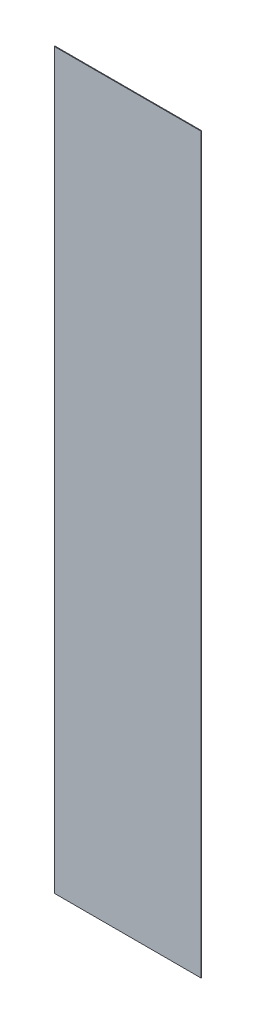
ISO-10303-21;
HEADER;
FILE_DESCRIPTION(('STEP AP214'),'2;1');
FILE_NAME('part.step','',(''),(''),'','','');
FILE_SCHEMA(('AUTOMOTIVE_DESIGN { 1 0 10303 214 1 1 1 1 }'));
ENDSEC;
DATA;
#1=APPLICATION_CONTEXT('core data for automotive mechanical design processes');
#2=APPLICATION_PROTOCOL_DEFINITION('international standard','automotive_design',2000,#1);
#3=PRODUCT_CONTEXT('',#1,'mechanical');
#4=PRODUCT('Part','Part','',(#3));
#5=PRODUCT_RELATED_PRODUCT_CATEGORY('part','',(#4));
#6=PRODUCT_DEFINITION_FORMATION('','',#4);
#7=PRODUCT_DEFINITION_CONTEXT('part definition',#1,'design');
#8=PRODUCT_DEFINITION('design','',#6,#7);
#9=PRODUCT_DEFINITION_SHAPE('','',#8);
#10=(LENGTH_UNIT() NAMED_UNIT(*) SI_UNIT(.MILLI.,.METRE.));
#11=(NAMED_UNIT(*) PLANE_ANGLE_UNIT() SI_UNIT($,.RADIAN.));
#12=(NAMED_UNIT(*) SI_UNIT($,.STERADIAN.) SOLID_ANGLE_UNIT());
#13=UNCERTAINTY_MEASURE_WITH_UNIT(LENGTH_MEASURE(1.E-05),#10,'distance_accuracy_value','');
#14=(GEOMETRIC_REPRESENTATION_CONTEXT(3) GLOBAL_UNCERTAINTY_ASSIGNED_CONTEXT((#13)) GLOBAL_UNIT_ASSIGNED_CONTEXT((#10,
#11,#12)) REPRESENTATION_CONTEXT('',''));
#15=CARTESIAN_POINT('',(0.,0.,0.));
#16=DIRECTION('',(0.,0.,1.));
#17=DIRECTION('',(1.,0.,0.));
#18=AXIS2_PLACEMENT_3D('',#15,#16,#17);
#19=CARTESIAN_POINT('',(200.,1000.,1.9));
#20=DIRECTION('',(-1.,0.,0.));
#21=DIRECTION('',(0.,-1.,0.));
#22=AXIS2_PLACEMENT_3D('',#19,#20,#21);
#23=PLANE('',#22);
#24=DIRECTION('',(0.,1.,0.));
#25=VECTOR('',#24,1.);
#26=CARTESIAN_POINT('',(200.,1000.,0.));
#27=LINE('',#26,#25);
#28=CARTESIAN_POINT('',(200.,-1000.,0.));
#29=VERTEX_POINT('',#28);
#30=CARTESIAN_POINT('',(200.,1000.,0.));
#31=VERTEX_POINT('',#30);
#32=EDGE_CURVE('E95',#29,#31,#27,.T.);
#33=ORIENTED_EDGE('',*,*,#32,.T.);
#34=DIRECTION('',(0.,0.,-1.));
#35=VECTOR('',#34,1.);
#36=CARTESIAN_POINT('',(200.,1000.,1.9));
#37=LINE('',#36,#35);
#38=CARTESIAN_POINT('',(200.,1000.,1.9));
#39=VERTEX_POINT('',#38);
#40=EDGE_CURVE('E11',#39,#31,#37,.T.);
#41=ORIENTED_EDGE('',*,*,#40,.F.);
#42=DIRECTION('',(0.,1.,0.));
#43=VECTOR('',#42,1.);
#44=CARTESIAN_POINT('',(200.,1000.,1.9));
#45=LINE('',#44,#43);
#46=CARTESIAN_POINT('',(200.,-1000.,1.9));
#47=VERTEX_POINT('',#46);
#48=EDGE_CURVE('E83',#47,#39,#45,.T.);
#49=ORIENTED_EDGE('',*,*,#48,.F.);
#50=DIRECTION('',(0.,0.,-1.));
#51=VECTOR('',#50,1.);
#52=CARTESIAN_POINT('',(200.,-1000.,1.9));
#53=LINE('',#52,#51);
#54=EDGE_CURVE('E91',#47,#29,#53,.T.);
#55=ORIENTED_EDGE('',*,*,#54,.T.);
#56=EDGE_LOOP('',(#33,#41,#49,#55));
#57=FACE_BOUND('',#56,.T.);
#58=ADVANCED_FACE('F32',(#57),#23,.F.);
#59=CARTESIAN_POINT('',(-200.,1000.,1.9));
#60=DIRECTION('',(0.,-1.,0.));
#61=DIRECTION('',(0.,0.,-1.));
#62=AXIS2_PLACEMENT_3D('',#59,#60,#61);
#63=PLANE('',#62);
#64=DIRECTION('',(-1.,0.,0.));
#65=VECTOR('',#64,1.);
#66=CARTESIAN_POINT('',(-200.,1000.,0.));
#67=LINE('',#66,#65);
#68=CARTESIAN_POINT('',(-200.,1000.,0.));
#69=VERTEX_POINT('',#68);
#70=EDGE_CURVE('E87',#31,#69,#67,.T.);
#71=ORIENTED_EDGE('',*,*,#70,.T.);
#72=DIRECTION('',(0.,0.,-1.));
#73=VECTOR('',#72,1.);
#74=CARTESIAN_POINT('',(-200.,1000.,1.9));
#75=LINE('',#74,#73);
#76=CARTESIAN_POINT('',(-200.,1000.,1.9));
#77=VERTEX_POINT('',#76);
#78=EDGE_CURVE('E40',#77,#69,#75,.T.);
#79=ORIENTED_EDGE('',*,*,#78,.F.);
#80=DIRECTION('',(-1.,0.,0.));
#81=VECTOR('',#80,1.);
#82=CARTESIAN_POINT('',(-200.,1000.,1.9));
#83=LINE('',#82,#81);
#84=EDGE_CURVE('E78',#39,#77,#83,.T.);
#85=ORIENTED_EDGE('',*,*,#84,.F.);
#86=ORIENTED_EDGE('',*,*,#40,.T.);
#87=EDGE_LOOP('',(#71,#79,#85,#86));
#88=FACE_BOUND('',#87,.T.);
#89=ADVANCED_FACE('F86',(#88),#63,.F.);
#90=CARTESIAN_POINT('',(-200.,1000.,1.9));
#91=DIRECTION('',(1.,0.,0.));
#92=DIRECTION('',(0.,1.,0.));
#93=AXIS2_PLACEMENT_3D('',#90,#91,#92);
#94=PLANE('',#93);
#95=DIRECTION('',(0.,-1.,0.));
#96=VECTOR('',#95,1.);
#97=CARTESIAN_POINT('',(-200.,1000.,0.));
#98=LINE('',#97,#96);
#99=CARTESIAN_POINT('',(-200.,-1000.,0.));
#100=VERTEX_POINT('',#99);
#101=EDGE_CURVE('E65',#69,#100,#98,.T.);
#102=ORIENTED_EDGE('',*,*,#101,.T.);
#103=DIRECTION('',(0.,0.,-1.));
#104=VECTOR('',#103,1.);
#105=CARTESIAN_POINT('',(-200.,-1000.,1.9));
#106=LINE('',#105,#104);
#107=CARTESIAN_POINT('',(-200.,-1000.,1.9));
#108=VERTEX_POINT('',#107);
#109=EDGE_CURVE('E88',#108,#100,#106,.T.);
#110=ORIENTED_EDGE('',*,*,#109,.F.);
#111=DIRECTION('',(0.,-1.,0.));
#112=VECTOR('',#111,1.);
#113=CARTESIAN_POINT('',(-200.,1000.,1.9));
#114=LINE('',#113,#112);
#115=EDGE_CURVE('E81',#77,#108,#114,.T.);
#116=ORIENTED_EDGE('',*,*,#115,.F.);
#117=ORIENTED_EDGE('',*,*,#78,.T.);
#118=EDGE_LOOP('',(#102,#110,#116,#117));
#119=FACE_BOUND('',#118,.T.);
#120=ADVANCED_FACE('F89',(#119),#94,.F.);
#121=CARTESIAN_POINT('',(-200.,-1000.,1.9));
#122=DIRECTION('',(0.,1.,0.));
#123=DIRECTION('',(0.,0.,1.));
#124=AXIS2_PLACEMENT_3D('',#121,#122,#123);
#125=PLANE('',#124);
#126=DIRECTION('',(1.,0.,0.));
#127=VECTOR('',#126,1.);
#128=CARTESIAN_POINT('',(-200.,-1000.,0.));
#129=LINE('',#128,#127);
#130=EDGE_CURVE('E71',#100,#29,#129,.T.);
#131=ORIENTED_EDGE('',*,*,#130,.T.);
#132=ORIENTED_EDGE('',*,*,#54,.F.);
#133=DIRECTION('',(1.,0.,0.));
#134=VECTOR('',#133,1.);
#135=CARTESIAN_POINT('',(-200.,-1000.,1.9));
#136=LINE('',#135,#134);
#137=EDGE_CURVE('E48',#108,#47,#136,.T.);
#138=ORIENTED_EDGE('',*,*,#137,.F.);
#139=ORIENTED_EDGE('',*,*,#109,.T.);
#140=EDGE_LOOP('',(#131,#132,#138,#139));
#141=FACE_BOUND('',#140,.T.);
#142=ADVANCED_FACE('F102',(#141),#125,.F.);
#143=CARTESIAN_POINT('',(0.,0.,1.9));
#144=DIRECTION('',(0.,0.,1.));
#145=DIRECTION('',(1.,0.,0.));
#146=AXIS2_PLACEMENT_3D('',#143,#144,#145);
#147=PLANE('',#146);
#148=ORIENTED_EDGE('',*,*,#48,.T.);
#149=ORIENTED_EDGE('',*,*,#84,.T.);
#150=ORIENTED_EDGE('',*,*,#115,.T.);
#151=ORIENTED_EDGE('',*,*,#137,.T.);
#152=EDGE_LOOP('',(#148,#149,#150,#151));
#153=FACE_BOUND('',#152,.T.);
#154=ADVANCED_FACE('F79',(#153),#147,.T.);
#155=CARTESIAN_POINT('',(0.,0.,0.));
#156=DIRECTION('',(0.,0.,1.));
#157=DIRECTION('',(1.,0.,0.));
#158=AXIS2_PLACEMENT_3D('',#155,#156,#157);
#159=PLANE('',#158);
#160=ORIENTED_EDGE('',*,*,#32,.F.);
#161=ORIENTED_EDGE('',*,*,#130,.F.);
#162=ORIENTED_EDGE('',*,*,#101,.F.);
#163=ORIENTED_EDGE('',*,*,#70,.F.);
#164=EDGE_LOOP('',(#160,#161,#162,#163));
#165=FACE_BOUND('',#164,.T.);
#166=ADVANCED_FACE('F105',(#165),#159,.F.);
#167=CLOSED_SHELL('',(#58,#89,#120,#142,#154,#166));
#168=MANIFOLD_SOLID_BREP('B2',#167);
#169=ADVANCED_BREP_SHAPE_REPRESENTATION('',(#18,#168),#14);
#170=SHAPE_DEFINITION_REPRESENTATION(#9,#169);
ENDSEC;
END-ISO-10303-21;
